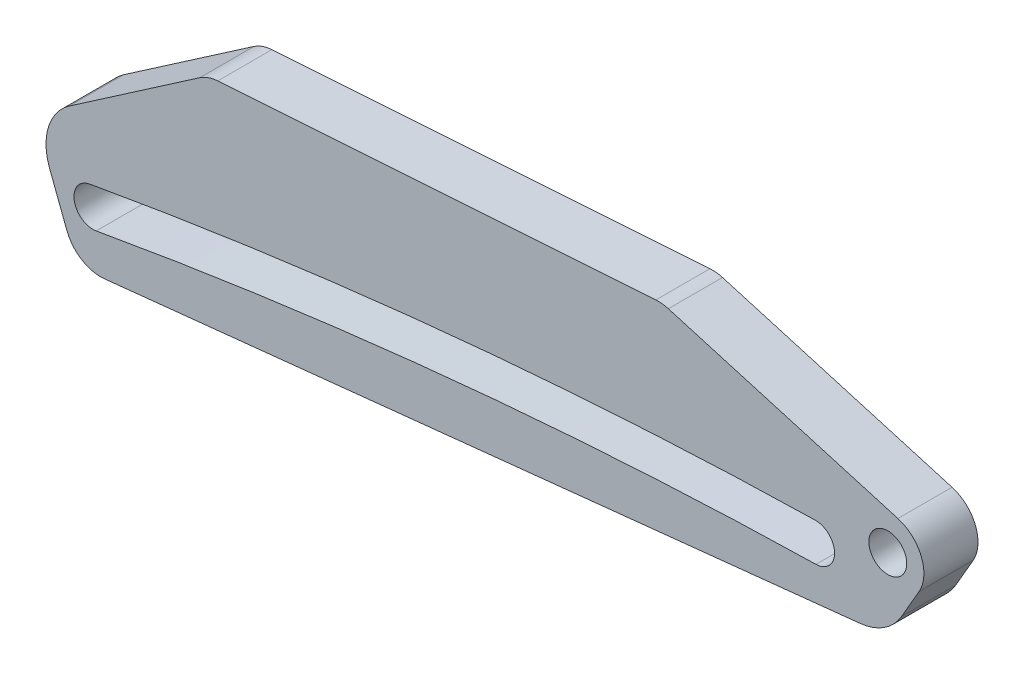
ISO-10303-21;
HEADER;
FILE_DESCRIPTION(('STEP AP214'),'2;1');
FILE_NAME('part.step','',(''),(''),'','','');
FILE_SCHEMA(('AUTOMOTIVE_DESIGN { 1 0 10303 214 1 1 1 1 }'));
ENDSEC;
DATA;
#1=APPLICATION_CONTEXT('core data for automotive mechanical design processes');
#2=APPLICATION_PROTOCOL_DEFINITION('international standard','automotive_design',2000,#1);
#3=PRODUCT_CONTEXT('',#1,'mechanical');
#4=PRODUCT('Part','Part','',(#3));
#5=PRODUCT_RELATED_PRODUCT_CATEGORY('part','',(#4));
#6=PRODUCT_DEFINITION_FORMATION('','',#4);
#7=PRODUCT_DEFINITION_CONTEXT('part definition',#1,'design');
#8=PRODUCT_DEFINITION('design','',#6,#7);
#9=PRODUCT_DEFINITION_SHAPE('','',#8);
#10=(LENGTH_UNIT() NAMED_UNIT(*) SI_UNIT(.MILLI.,.METRE.));
#11=(NAMED_UNIT(*) PLANE_ANGLE_UNIT() SI_UNIT($,.RADIAN.));
#12=(NAMED_UNIT(*) SI_UNIT($,.STERADIAN.) SOLID_ANGLE_UNIT());
#13=UNCERTAINTY_MEASURE_WITH_UNIT(LENGTH_MEASURE(1.E-05),#10,'distance_accuracy_value','');
#14=(GEOMETRIC_REPRESENTATION_CONTEXT(3) GLOBAL_UNCERTAINTY_ASSIGNED_CONTEXT((#13)) GLOBAL_UNIT_ASSIGNED_CONTEXT((#10,
#11,#12)) REPRESENTATION_CONTEXT('',''));
#15=CARTESIAN_POINT('',(0.,0.,0.));
#16=DIRECTION('',(0.,0.,1.));
#17=DIRECTION('',(1.,0.,0.));
#18=AXIS2_PLACEMENT_3D('',#15,#16,#17);
#19=CARTESIAN_POINT('',(1.46781969528307,-261.442499310482,0.));
#20=DIRECTION('',(0.,0.,1.));
#21=DIRECTION('',(1.,0.,0.));
#22=AXIS2_PLACEMENT_3D('',#19,#20,#21);
#23=CYLINDRICAL_SURFACE('',#22,261.05);
#24=DIRECTION('',(0.,0.,1.));
#25=VECTOR('',#24,1.);
#26=CARTESIAN_POINT('',(-44.2332287677884,-4.42398505639943,-4.94016647332351));
#27=LINE('',#26,#25);
#28=CARTESIAN_POINT('',(-44.2332287677884,-4.42398505639943,0.));
#29=VERTEX_POINT('',#28);
#30=CARTESIAN_POINT('',(-44.2332287677884,-4.42398505639943,3.));
#31=VERTEX_POINT('',#30);
#32=EDGE_CURVE('E162',#29,#31,#27,.T.);
#33=ORIENTED_EDGE('',*,*,#32,.F.);
#34=CARTESIAN_POINT('',(1.46781969528307,-261.442499310482,0.));
#35=DIRECTION('',(0.,0.,1.));
#36=DIRECTION('',(1.,0.,0.));
#37=AXIS2_PLACEMENT_3D('',#34,#35,#36);
#38=CIRCLE('',#37,261.05);
#39=CARTESIAN_POINT('',(-4.02208157953863,-0.450232214323054,0.));
#40=VERTEX_POINT('',#39);
#41=EDGE_CURVE('E189',#40,#29,#38,.T.);
#42=ORIENTED_EDGE('',*,*,#41,.F.);
#43=DIRECTION('',(0.,0.,1.));
#44=VECTOR('',#43,1.);
#45=CARTESIAN_POINT('',(-4.02208157953863,-0.450232214323054,0.));
#46=LINE('',#45,#44);
#47=CARTESIAN_POINT('',(-4.02208157953863,-0.450232214323054,3.));
#48=VERTEX_POINT('',#47);
#49=EDGE_CURVE('E198',#40,#48,#46,.T.);
#50=ORIENTED_EDGE('',*,*,#49,.T.);
#51=CARTESIAN_POINT('',(1.46781969528307,-261.442499310482,3.));
#52=DIRECTION('',(0.,0.,1.));
#53=DIRECTION('',(1.,0.,0.));
#54=AXIS2_PLACEMENT_3D('',#51,#52,#53);
#55=CIRCLE('',#54,261.05);
#56=EDGE_CURVE('E184',#48,#31,#55,.T.);
#57=ORIENTED_EDGE('',*,*,#56,.T.);
#58=EDGE_LOOP('',(#33,#42,#50,#57));
#59=FACE_BOUND('',#58,.T.);
#60=ADVANCED_FACE('F39',(#59),#23,.F.);
#61=CARTESIAN_POINT('',(0.,0.,3.));
#62=DIRECTION('',(0.,0.,1.));
#63=DIRECTION('',(1.,0.,0.));
#64=AXIS2_PLACEMENT_3D('',#61,#62,#63);
#65=PLANE('',#64);
#66=DIRECTION('',(-0.96007184811554,0.279753545922139,0.));
#67=VECTOR('',#66,1.);
#68=CARTESIAN_POINT('',(-12.5,5.72552912036351,3.));
#69=LINE('',#68,#67);
#70=CARTESIAN_POINT('',(0.559507091844279,1.92014369623108,3.));
#71=VERTEX_POINT('',#70);
#72=CARTESIAN_POINT('',(-12.1601101311318,5.62648924514425,3.));
#73=VERTEX_POINT('',#72);
#74=EDGE_CURVE('E227',#71,#73,#69,.T.);
#75=ORIENTED_EDGE('',*,*,#74,.T.);
#76=CARTESIAN_POINT('',(-12.7196172229761,3.70634554891317,3.));
#77=DIRECTION('',(0.,0.,1.));
#78=DIRECTION('',(1.,0.,0.));
#79=AXIS2_PLACEMENT_3D('',#76,#77,#78);
#80=CIRCLE('',#79,2.);
#81=CARTESIAN_POINT('',(-12.8532344898128,5.70187716379756,3.));
#82=VERTEX_POINT('',#81);
#83=EDGE_CURVE('E48',#73,#82,#80,.T.);
#84=ORIENTED_EDGE('',*,*,#83,.T.);
#85=DIRECTION('',(-0.997765807442194,-0.0668086334183352,0.));
#86=VECTOR('',#85,1.);
#87=CARTESIAN_POINT('',(-37.6791048015793,4.03958080469325,3.));
#88=LINE('',#87,#86);
#89=CARTESIAN_POINT('',(-37.131316921323,4.0762597121183,3.));
#90=VERTEX_POINT('',#89);
#91=EDGE_CURVE('E210',#82,#90,#88,.T.);
#92=ORIENTED_EDGE('',*,*,#91,.T.);
#93=CARTESIAN_POINT('',(-36.9976996544863,2.08072809723391,3.));
#94=DIRECTION('',(0.,0.,1.));
#95=DIRECTION('',(1.,0.,0.));
#96=AXIS2_PLACEMENT_3D('',#93,#94,#95);
#97=CIRCLE('',#96,2.);
#98=CARTESIAN_POINT('',(-38.1313952983483,3.72837314004146,3.));
#99=VERTEX_POINT('',#98);
#100=EDGE_CURVE('E55',#90,#99,#97,.T.);
#101=ORIENTED_EDGE('',*,*,#100,.T.);
#102=DIRECTION('',(-0.823822521403776,-0.566847821931006,0.));
#103=VECTOR('',#102,1.);
#104=CARTESIAN_POINT('',(-51.6017054133031,-5.54014738594075,3.));
#105=LINE('',#104,#103);
#106=CARTESIAN_POINT('',(-45.3497727668886,-1.23837811961789,3.));
#107=VERTEX_POINT('',#106);
#108=EDGE_CURVE('E213',#99,#107,#105,.T.);
#109=ORIENTED_EDGE('',*,*,#108,.T.);
#110=CARTESIAN_POINT('',(-43.6492293010956,-3.70984568382921,3.));
#111=DIRECTION('',(0.,0.,1.));
#112=DIRECTION('',(1.,0.,0.));
#113=AXIS2_PLACEMENT_3D('',#110,#111,#112);
#114=CIRCLE('',#113,3.);
#115=CARTESIAN_POINT('',(-46.4499705805872,-4.78494953246508,3.));
#116=VERTEX_POINT('',#115);
#117=EDGE_CURVE('E295',#107,#116,#114,.T.);
#118=ORIENTED_EDGE('',*,*,#117,.T.);
#119=DIRECTION('',(-0.358367949545291,0.933580426497206,0.));
#120=VECTOR('',#119,1.);
#121=CARTESIAN_POINT('',(-42.0853910215916,-16.1550680135909,3.));
#122=LINE('',#121,#120);
#123=CARTESIAN_POINT('',(-45.4881897622409,-7.29047422497155,3.));
#124=VERTEX_POINT('',#123);
#125=EDGE_CURVE('E168',#124,#116,#122,.T.);
#126=ORIENTED_EDGE('',*,*,#125,.F.);
#127=CARTESIAN_POINT('',(-43.6210289092464,-6.57373832588098,3.));
#128=DIRECTION('',(0.,0.,1.));
#129=DIRECTION('',(1.,0.,0.));
#130=AXIS2_PLACEMENT_3D('',#127,#128,#129);
#131=CIRCLE('',#130,2.);
#132=CARTESIAN_POINT('',(-43.4119719827111,-8.56278211661753,3.));
#133=VERTEX_POINT('',#132);
#134=EDGE_CURVE('E267',#124,#133,#131,.T.);
#135=ORIENTED_EDGE('',*,*,#134,.T.);
#136=DIRECTION('',(0.994521895368274,0.104528463267647,0.));
#137=VECTOR('',#136,1.);
#138=CARTESIAN_POINT('',(0.,-4.,3.));
#139=LINE('',#138,#137);
#140=CARTESIAN_POINT('',(-1.52020264730873,-4.15977973669423,3.));
#141=VERTEX_POINT('',#140);
#142=EDGE_CURVE('E217',#133,#141,#139,.T.);
#143=ORIENTED_EDGE('',*,*,#142,.T.);
#144=CARTESIAN_POINT('',(-1.83378803711167,-1.17621405058941,3.));
#145=DIRECTION('',(0.,0.,1.));
#146=DIRECTION('',(1.,0.,0.));
#147=AXIS2_PLACEMENT_3D('',#144,#145,#146);
#148=CIRCLE('',#147,3.);
#149=CARTESIAN_POINT('',(0.76428817424165,-2.67621405058941,3.));
#150=VERTEX_POINT('',#149);
#151=EDGE_CURVE('E280',#141,#150,#148,.T.);
#152=ORIENTED_EDGE('',*,*,#151,.T.);
#153=DIRECTION('',(0.5,0.866025403784439,0.));
#154=VECTOR('',#153,1.);
#155=CARTESIAN_POINT('',(1.73205080756888,-0.999999999999999,3.));
#156=LINE('',#155,#154);
#157=CARTESIAN_POINT('',(1.73205080756888,-0.999999999999999,3.));
#158=VERTEX_POINT('',#157);
#159=EDGE_CURVE('E221',#150,#158,#156,.T.);
#160=ORIENTED_EDGE('',*,*,#159,.T.);
#161=CARTESIAN_POINT('',(0.,0.,3.));
#162=DIRECTION('',(0.,0.,1.));
#163=DIRECTION('',(1.,0.,0.));
#164=AXIS2_PLACEMENT_3D('',#161,#162,#163);
#165=CIRCLE('',#164,2.);
#166=EDGE_CURVE('E224',#158,#71,#165,.T.);
#167=ORIENTED_EDGE('',*,*,#166,.T.);
#168=EDGE_LOOP('',(#75,#84,#92,#101,#109,#118,#126,#135,#143,#152,#160,#167));
#169=FACE_BOUND('',#168,.T.);
#170=CARTESIAN_POINT('',(1.46781969528307,-261.442499310482,3.));
#171=DIRECTION('',(0.,0.,-1.));
#172=DIRECTION('',(1.,0.,0.));
#173=AXIS2_PLACEMENT_3D('',#170,#171,#172);
#174=CIRCLE('',#173,258.95);
#175=CARTESIAN_POINT('',(-43.8655896114105,-6.49155402760641,3.));
#176=VERTEX_POINT('',#175);
#177=CARTESIAN_POINT('',(-3.97791842046134,-2.54976778567706,3.));
#178=VERTEX_POINT('',#177);
#179=EDGE_CURVE('E173',#176,#178,#174,.T.);
#180=ORIENTED_EDGE('',*,*,#179,.F.);
#181=CARTESIAN_POINT('',(-44.0494091895994,-5.45776954200292,3.));
#182=DIRECTION('',(0.,0.,-1.));
#183=DIRECTION('',(1.,0.,0.));
#184=AXIS2_PLACEMENT_3D('',#181,#182,#183);
#185=CIRCLE('',#184,1.05000000000002);
#186=EDGE_CURVE('E156',#176,#31,#185,.T.);
#187=ORIENTED_EDGE('',*,*,#186,.T.);
#188=ORIENTED_EDGE('',*,*,#56,.F.);
#189=CARTESIAN_POINT('',(-4.,-1.5,3.));
#190=DIRECTION('',(0.,0.,1.));
#191=DIRECTION('',(1.,0.,0.));
#192=AXIS2_PLACEMENT_3D('',#189,#190,#191);
#193=CIRCLE('',#192,1.05000000000005);
#194=EDGE_CURVE('E181',#178,#48,#193,.T.);
#195=ORIENTED_EDGE('',*,*,#194,.F.);
#196=EDGE_LOOP('',(#180,#187,#188,#195));
#197=FACE_BOUND('',#196,.T.);
#198=CARTESIAN_POINT('',(0.,0.,3.));
#199=DIRECTION('',(0.,0.,1.));
#200=DIRECTION('',(1.,0.,0.));
#201=AXIS2_PLACEMENT_3D('',#198,#199,#200);
#202=CIRCLE('',#201,1.05);
#203=CARTESIAN_POINT('',(1.05,0.,3.));
#204=VERTEX_POINT('',#203);
#205=EDGE_CURVE('E202',#204,#204,#202,.T.);
#206=ORIENTED_EDGE('',*,*,#205,.F.);
#207=EDGE_LOOP('',(#206));
#208=FACE_BOUND('',#207,.T.);
#209=ADVANCED_FACE('F179',(#169,#197,#208),#65,.T.);
#210=CARTESIAN_POINT('',(0.,0.,0.));
#211=DIRECTION('',(0.,0.,1.));
#212=DIRECTION('',(1.,0.,0.));
#213=AXIS2_PLACEMENT_3D('',#210,#211,#212);
#214=PLANE('',#213);
#215=CARTESIAN_POINT('',(-44.0494091895994,-5.45776954200292,0.));
#216=DIRECTION('',(0.,0.,1.));
#217=DIRECTION('',(1.,0.,0.));
#218=AXIS2_PLACEMENT_3D('',#215,#216,#217);
#219=CIRCLE('',#218,1.05000000000002);
#220=CARTESIAN_POINT('',(-43.8655896114105,-6.49155402760641,0.));
#221=VERTEX_POINT('',#220);
#222=EDGE_CURVE('E366',#29,#221,#219,.T.);
#223=ORIENTED_EDGE('',*,*,#222,.T.);
#224=CARTESIAN_POINT('',(1.46781969528307,-261.442499310482,0.));
#225=DIRECTION('',(0.,0.,-1.));
#226=DIRECTION('',(1.,0.,0.));
#227=AXIS2_PLACEMENT_3D('',#224,#225,#226);
#228=CIRCLE('',#227,258.95);
#229=CARTESIAN_POINT('',(-3.97791842046134,-2.54976778567706,0.));
#230=VERTEX_POINT('',#229);
#231=EDGE_CURVE('E175',#221,#230,#228,.T.);
#232=ORIENTED_EDGE('',*,*,#231,.T.);
#233=CARTESIAN_POINT('',(-4.,-1.5,0.));
#234=DIRECTION('',(0.,0.,1.));
#235=DIRECTION('',(1.,0.,0.));
#236=AXIS2_PLACEMENT_3D('',#233,#234,#235);
#237=CIRCLE('',#236,1.05000000000005);
#238=EDGE_CURVE('E183',#230,#40,#237,.T.);
#239=ORIENTED_EDGE('',*,*,#238,.T.);
#240=ORIENTED_EDGE('',*,*,#41,.T.);
#241=EDGE_LOOP('',(#223,#232,#239,#240));
#242=FACE_BOUND('',#241,.T.);
#243=DIRECTION('',(-0.997765807442194,-0.0668086334183352,0.));
#244=VECTOR('',#243,1.);
#245=CARTESIAN_POINT('',(-37.6791048015793,4.03958080469325,0.));
#246=LINE('',#245,#244);
#247=CARTESIAN_POINT('',(-12.8532344898128,5.70187716379756,0.));
#248=VERTEX_POINT('',#247);
#249=CARTESIAN_POINT('',(-37.131316921323,4.0762597121183,0.));
#250=VERTEX_POINT('',#249);
#251=EDGE_CURVE('E206',#248,#250,#246,.T.);
#252=ORIENTED_EDGE('',*,*,#251,.F.);
#253=CARTESIAN_POINT('',(-12.7196172229761,3.70634554891317,0.));
#254=DIRECTION('',(0.,0.,1.));
#255=DIRECTION('',(1.,0.,0.));
#256=AXIS2_PLACEMENT_3D('',#253,#254,#255);
#257=CIRCLE('',#256,2.);
#258=CARTESIAN_POINT('',(-12.1601101311318,5.62648924514425,0.));
#259=VERTEX_POINT('',#258);
#260=EDGE_CURVE('E308',#248,#259,#257,.F.);
#261=ORIENTED_EDGE('',*,*,#260,.T.);
#262=DIRECTION('',(-0.96007184811554,0.279753545922139,0.));
#263=VECTOR('',#262,1.);
#264=CARTESIAN_POINT('',(-12.5,5.72552912036351,0.));
#265=LINE('',#264,#263);
#266=CARTESIAN_POINT('',(0.559507091844279,1.92014369623108,0.));
#267=VERTEX_POINT('',#266);
#268=EDGE_CURVE('E214',#267,#259,#265,.T.);
#269=ORIENTED_EDGE('',*,*,#268,.F.);
#270=CARTESIAN_POINT('',(0.,0.,0.));
#271=DIRECTION('',(0.,0.,1.));
#272=DIRECTION('',(1.,0.,0.));
#273=AXIS2_PLACEMENT_3D('',#270,#271,#272);
#274=CIRCLE('',#273,2.);
#275=CARTESIAN_POINT('',(1.73205080756888,-0.999999999999999,0.));
#276=VERTEX_POINT('',#275);
#277=EDGE_CURVE('E244',#276,#267,#274,.T.);
#278=ORIENTED_EDGE('',*,*,#277,.F.);
#279=DIRECTION('',(0.5,0.866025403784439,0.));
#280=VECTOR('',#279,1.);
#281=CARTESIAN_POINT('',(1.73205080756888,-0.999999999999999,0.));
#282=LINE('',#281,#280);
#283=CARTESIAN_POINT('',(0.76428817424165,-2.67621405058941,0.));
#284=VERTEX_POINT('',#283);
#285=EDGE_CURVE('E241',#284,#276,#282,.T.);
#286=ORIENTED_EDGE('',*,*,#285,.F.);
#287=CARTESIAN_POINT('',(-1.83378803711167,-1.17621405058941,0.));
#288=DIRECTION('',(0.,0.,1.));
#289=DIRECTION('',(1.,0.,0.));
#290=AXIS2_PLACEMENT_3D('',#287,#288,#289);
#291=CIRCLE('',#290,3.);
#292=CARTESIAN_POINT('',(-1.52020264730873,-4.15977973669423,0.));
#293=VERTEX_POINT('',#292);
#294=EDGE_CURVE('E274',#284,#293,#291,.F.);
#295=ORIENTED_EDGE('',*,*,#294,.T.);
#296=DIRECTION('',(0.994521895368274,0.104528463267647,0.));
#297=VECTOR('',#296,1.);
#298=CARTESIAN_POINT('',(0.,-4.,0.));
#299=LINE('',#298,#297);
#300=CARTESIAN_POINT('',(-43.4119719827111,-8.56278211661753,0.));
#301=VERTEX_POINT('',#300);
#302=EDGE_CURVE('E237',#301,#293,#299,.T.);
#303=ORIENTED_EDGE('',*,*,#302,.F.);
#304=CARTESIAN_POINT('',(-43.6210289092464,-6.57373832588098,0.));
#305=DIRECTION('',(0.,0.,1.));
#306=DIRECTION('',(1.,0.,0.));
#307=AXIS2_PLACEMENT_3D('',#304,#305,#306);
#308=CIRCLE('',#307,2.);
#309=CARTESIAN_POINT('',(-45.4881897622409,-7.29047422497156,0.));
#310=VERTEX_POINT('',#309);
#311=EDGE_CURVE('E260',#301,#310,#308,.F.);
#312=ORIENTED_EDGE('',*,*,#311,.T.);
#313=DIRECTION('',(0.358367949545291,-0.933580426497205,0.));
#314=VECTOR('',#313,1.);
#315=CARTESIAN_POINT('',(-47.2970470912231,-2.57823977764864,0.));
#316=LINE('',#315,#314);
#317=CARTESIAN_POINT('',(-46.4499705805872,-4.78494953246509,0.));
#318=VERTEX_POINT('',#317);
#319=EDGE_CURVE('E356',#318,#310,#316,.T.);
#320=ORIENTED_EDGE('',*,*,#319,.F.);
#321=CARTESIAN_POINT('',(-43.6492293010956,-3.70984568382921,0.));
#322=DIRECTION('',(0.,0.,1.));
#323=DIRECTION('',(1.,0.,0.));
#324=AXIS2_PLACEMENT_3D('',#321,#322,#323);
#325=CIRCLE('',#324,3.);
#326=CARTESIAN_POINT('',(-45.3497727668886,-1.23837811961789,0.));
#327=VERTEX_POINT('',#326);
#328=EDGE_CURVE('E287',#318,#327,#325,.F.);
#329=ORIENTED_EDGE('',*,*,#328,.T.);
#330=DIRECTION('',(-0.823822521403776,-0.566847821931006,0.));
#331=VECTOR('',#330,1.);
#332=CARTESIAN_POINT('',(-51.6017054133031,-5.54014738594075,0.));
#333=LINE('',#332,#331);
#334=CARTESIAN_POINT('',(-38.1313952983483,3.72837314004146,0.));
#335=VERTEX_POINT('',#334);
#336=EDGE_CURVE('E234',#335,#327,#333,.T.);
#337=ORIENTED_EDGE('',*,*,#336,.F.);
#338=CARTESIAN_POINT('',(-36.9976996544863,2.08072809723391,0.));
#339=DIRECTION('',(0.,0.,1.));
#340=DIRECTION('',(1.,0.,0.));
#341=AXIS2_PLACEMENT_3D('',#338,#339,#340);
#342=CIRCLE('',#341,2.);
#343=EDGE_CURVE('E305',#335,#250,#342,.F.);
#344=ORIENTED_EDGE('',*,*,#343,.T.);
#345=EDGE_LOOP('',(#252,#261,#269,#278,#286,#295,#303,#312,#320,#329,#337,#344));
#346=FACE_BOUND('',#345,.T.);
#347=CARTESIAN_POINT('',(0.,0.,0.));
#348=DIRECTION('',(0.,0.,1.));
#349=DIRECTION('',(1.,0.,0.));
#350=AXIS2_PLACEMENT_3D('',#347,#348,#349);
#351=CIRCLE('',#350,1.05);
#352=CARTESIAN_POINT('',(1.05,0.,0.));
#353=VERTEX_POINT('',#352);
#354=EDGE_CURVE('E197',#353,#353,#351,.T.);
#355=ORIENTED_EDGE('',*,*,#354,.T.);
#356=EDGE_LOOP('',(#355));
#357=FACE_BOUND('',#356,.T.);
#358=ADVANCED_FACE('F326',(#242,#346,#357),#214,.F.);
#359=CARTESIAN_POINT('',(-37.6791048015793,4.03958080469325,3.));
#360=DIRECTION('',(0.0668086334183352,-0.997765807442195,0.));
#361=DIRECTION('',(0.997765807442195,0.0668086334183352,0.));
#362=AXIS2_PLACEMENT_3D('',#359,#360,#361);
#363=PLANE('',#362);
#364=ORIENTED_EDGE('',*,*,#91,.F.);
#365=DIRECTION('',(0.,0.,-1.));
#366=VECTOR('',#365,1.);
#367=CARTESIAN_POINT('',(-12.8532344898128,5.70187716379756,3.));
#368=LINE('',#367,#366);
#369=EDGE_CURVE('E301',#82,#248,#368,.T.);
#370=ORIENTED_EDGE('',*,*,#369,.T.);
#371=ORIENTED_EDGE('',*,*,#251,.T.);
#372=DIRECTION('',(0.,0.,-1.));
#373=VECTOR('',#372,1.);
#374=CARTESIAN_POINT('',(-37.131316921323,4.0762597121183,3.));
#375=LINE('',#374,#373);
#376=EDGE_CURVE('E298',#250,#90,#375,.F.);
#377=ORIENTED_EDGE('',*,*,#376,.T.);
#378=EDGE_LOOP('',(#364,#370,#371,#377));
#379=FACE_BOUND('',#378,.T.);
#380=ADVANCED_FACE('F320',(#379),#363,.F.);
#381=CARTESIAN_POINT('',(-51.6017054133031,-5.54014738594075,3.));
#382=DIRECTION('',(0.566847821931006,-0.823822521403776,0.));
#383=DIRECTION('',(0.823822521403776,0.566847821931006,0.));
#384=AXIS2_PLACEMENT_3D('',#381,#382,#383);
#385=PLANE('',#384);
#386=ORIENTED_EDGE('',*,*,#108,.F.);
#387=DIRECTION('',(0.,0.,-1.));
#388=VECTOR('',#387,1.);
#389=CARTESIAN_POINT('',(-38.1313952983483,3.72837314004146,3.));
#390=LINE('',#389,#388);
#391=EDGE_CURVE('E11',#99,#335,#390,.T.);
#392=ORIENTED_EDGE('',*,*,#391,.T.);
#393=ORIENTED_EDGE('',*,*,#336,.T.);
#394=DIRECTION('',(0.,0.,-1.));
#395=VECTOR('',#394,1.);
#396=CARTESIAN_POINT('',(-45.3497727668886,-1.23837811961789,3.));
#397=LINE('',#396,#395);
#398=EDGE_CURVE('E291',#327,#107,#397,.F.);
#399=ORIENTED_EDGE('',*,*,#398,.T.);
#400=EDGE_LOOP('',(#386,#392,#393,#399));
#401=FACE_BOUND('',#400,.T.);
#402=ADVANCED_FACE('F387',(#401),#385,.F.);
#403=CARTESIAN_POINT('',(0.,-4.,3.));
#404=DIRECTION('',(-0.104528463267647,0.994521895368274,0.));
#405=DIRECTION('',(-0.994521895368274,-0.104528463267647,0.));
#406=AXIS2_PLACEMENT_3D('',#403,#404,#405);
#407=PLANE('',#406);
#408=ORIENTED_EDGE('',*,*,#302,.T.);
#409=DIRECTION('',(0.,0.,-1.));
#410=VECTOR('',#409,1.);
#411=CARTESIAN_POINT('',(-1.52020264730873,-4.15977973669423,3.));
#412=LINE('',#411,#410);
#413=EDGE_CURVE('E277',#293,#141,#412,.F.);
#414=ORIENTED_EDGE('',*,*,#413,.T.);
#415=ORIENTED_EDGE('',*,*,#142,.F.);
#416=DIRECTION('',(0.,0.,-1.));
#417=VECTOR('',#416,1.);
#418=CARTESIAN_POINT('',(-43.4119719827111,-8.56278211661753,3.));
#419=LINE('',#418,#417);
#420=EDGE_CURVE('E256',#133,#301,#419,.T.);
#421=ORIENTED_EDGE('',*,*,#420,.T.);
#422=EDGE_LOOP('',(#408,#414,#415,#421));
#423=FACE_BOUND('',#422,.T.);
#424=ADVANCED_FACE('F347',(#423),#407,.F.);
#425=CARTESIAN_POINT('',(1.73205080756888,-0.999999999999999,3.));
#426=DIRECTION('',(-0.866025403784439,0.5,0.));
#427=DIRECTION('',(-0.5,-0.866025403784439,0.));
#428=AXIS2_PLACEMENT_3D('',#425,#426,#427);
#429=PLANE('',#428);
#430=ORIENTED_EDGE('',*,*,#159,.F.);
#431=DIRECTION('',(0.,0.,-1.));
#432=VECTOR('',#431,1.);
#433=CARTESIAN_POINT('',(0.76428817424165,-2.67621405058941,3.));
#434=LINE('',#433,#432);
#435=EDGE_CURVE('E270',#150,#284,#434,.T.);
#436=ORIENTED_EDGE('',*,*,#435,.T.);
#437=ORIENTED_EDGE('',*,*,#285,.T.);
#438=DIRECTION('',(0.,0.,-1.));
#439=VECTOR('',#438,1.);
#440=CARTESIAN_POINT('',(1.73205080756888,-0.999999999999999,3.));
#441=LINE('',#440,#439);
#442=EDGE_CURVE('E252',#158,#276,#441,.T.);
#443=ORIENTED_EDGE('',*,*,#442,.F.);
#444=EDGE_LOOP('',(#430,#436,#437,#443));
#445=FACE_BOUND('',#444,.T.);
#446=ADVANCED_FACE('F339',(#445),#429,.F.);
#447=CARTESIAN_POINT('',(0.,0.,3.));
#448=DIRECTION('',(0.,0.,-1.));
#449=DIRECTION('',(-1.,0.,0.));
#450=AXIS2_PLACEMENT_3D('',#447,#448,#449);
#451=CYLINDRICAL_SURFACE('',#450,2.);
#452=ORIENTED_EDGE('',*,*,#277,.T.);
#453=DIRECTION('',(0.,0.,-1.));
#454=VECTOR('',#453,1.);
#455=CARTESIAN_POINT('',(0.559507091844279,1.92014369623108,3.));
#456=LINE('',#455,#454);
#457=EDGE_CURVE('E230',#71,#267,#456,.T.);
#458=ORIENTED_EDGE('',*,*,#457,.F.);
#459=ORIENTED_EDGE('',*,*,#166,.F.);
#460=ORIENTED_EDGE('',*,*,#442,.T.);
#461=EDGE_LOOP('',(#452,#458,#459,#460));
#462=FACE_BOUND('',#461,.T.);
#463=ADVANCED_FACE('F333',(#462),#451,.T.);
#464=CARTESIAN_POINT('',(-12.5,5.72552912036351,3.));
#465=DIRECTION('',(-0.279753545922139,-0.96007184811554,0.));
#466=DIRECTION('',(0.960071848115541,-0.279753545922139,0.));
#467=AXIS2_PLACEMENT_3D('',#464,#465,#466);
#468=PLANE('',#467);
#469=ORIENTED_EDGE('',*,*,#268,.T.);
#470=DIRECTION('',(0.,0.,-1.));
#471=VECTOR('',#470,1.);
#472=CARTESIAN_POINT('',(-12.1601101311318,5.62648924514425,3.));
#473=LINE('',#472,#471);
#474=EDGE_CURVE('E63',#259,#73,#473,.F.);
#475=ORIENTED_EDGE('',*,*,#474,.T.);
#476=ORIENTED_EDGE('',*,*,#74,.F.);
#477=ORIENTED_EDGE('',*,*,#457,.T.);
#478=EDGE_LOOP('',(#469,#475,#476,#477));
#479=FACE_BOUND('',#478,.T.);
#480=ADVANCED_FACE('F329',(#479),#468,.F.);
#481=CARTESIAN_POINT('',(0.,0.,3.));
#482=DIRECTION('',(0.,0.,-1.));
#483=DIRECTION('',(-1.,0.,0.));
#484=AXIS2_PLACEMENT_3D('',#481,#482,#483);
#485=CYLINDRICAL_SURFACE('',#484,1.05);
#486=ORIENTED_EDGE('',*,*,#205,.T.);
#487=EDGE_LOOP('',(#486));
#488=FACE_BOUND('',#487,.T.);
#489=ORIENTED_EDGE('',*,*,#354,.F.);
#490=EDGE_LOOP('',(#489));
#491=FACE_BOUND('',#490,.T.);
#492=ADVANCED_FACE('F400',(#488,#491),#485,.F.);
#493=CARTESIAN_POINT('',(-4.,-1.5,0.));
#494=DIRECTION('',(0.,0.,1.));
#495=DIRECTION('',(1.,0.,0.));
#496=AXIS2_PLACEMENT_3D('',#493,#494,#495);
#497=CYLINDRICAL_SURFACE('',#496,1.05000000000005);
#498=ORIENTED_EDGE('',*,*,#194,.T.);
#499=ORIENTED_EDGE('',*,*,#49,.F.);
#500=ORIENTED_EDGE('',*,*,#238,.F.);
#501=DIRECTION('',(0.,0.,1.));
#502=VECTOR('',#501,1.);
#503=CARTESIAN_POINT('',(-3.97791842046134,-2.54976778567706,0.));
#504=LINE('',#503,#502);
#505=EDGE_CURVE('E194',#230,#178,#504,.T.);
#506=ORIENTED_EDGE('',*,*,#505,.T.);
#507=EDGE_LOOP('',(#498,#499,#500,#506));
#508=FACE_BOUND('',#507,.T.);
#509=ADVANCED_FACE('F376',(#508),#497,.F.);
#510=CARTESIAN_POINT('',(1.46781969528307,-261.442499310482,0.));
#511=DIRECTION('',(0.,0.,1.));
#512=DIRECTION('',(1.,0.,0.));
#513=AXIS2_PLACEMENT_3D('',#510,#511,#512);
#514=CYLINDRICAL_SURFACE('',#513,258.95);
#515=ORIENTED_EDGE('',*,*,#231,.F.);
#516=DIRECTION('',(0.,0.,1.));
#517=VECTOR('',#516,1.);
#518=CARTESIAN_POINT('',(-43.8655896114105,-6.49155402760641,-4.94016647332351));
#519=LINE('',#518,#517);
#520=EDGE_CURVE('E159',#221,#176,#519,.T.);
#521=ORIENTED_EDGE('',*,*,#520,.T.);
#522=ORIENTED_EDGE('',*,*,#179,.T.);
#523=ORIENTED_EDGE('',*,*,#505,.F.);
#524=EDGE_LOOP('',(#515,#521,#522,#523));
#525=FACE_BOUND('',#524,.T.);
#526=ADVANCED_FACE('F171',(#525),#514,.T.);
#527=CARTESIAN_POINT('',(-44.0494091895994,-5.45776954200292,-4.94016647332351));
#528=DIRECTION('',(0.,0.,1.));
#529=DIRECTION('',(1.,0.,0.));
#530=AXIS2_PLACEMENT_3D('',#527,#528,#529);
#531=CYLINDRICAL_SURFACE('',#530,1.05000000000002);
#532=ORIENTED_EDGE('',*,*,#222,.F.);
#533=ORIENTED_EDGE('',*,*,#32,.T.);
#534=ORIENTED_EDGE('',*,*,#186,.F.);
#535=ORIENTED_EDGE('',*,*,#520,.F.);
#536=EDGE_LOOP('',(#532,#533,#534,#535));
#537=FACE_BOUND('',#536,.T.);
#538=ADVANCED_FACE('F158',(#537),#531,.F.);
#539=CARTESIAN_POINT('',(-47.2970470912231,-2.57823977764864,3.000012));
#540=DIRECTION('',(0.933580426497205,0.358367949545291,0.));
#541=DIRECTION('',(-0.358367949545291,0.933580426497206,0.));
#542=AXIS2_PLACEMENT_3D('',#539,#540,#541);
#543=PLANE('',#542);
#544=ORIENTED_EDGE('',*,*,#125,.T.);
#545=DIRECTION('',(0.,0.,-1.));
#546=VECTOR('',#545,1.);
#547=CARTESIAN_POINT('',(-46.4499705805872,-4.78494953246508,3.000012));
#548=LINE('',#547,#546);
#549=EDGE_CURVE('E283',#116,#318,#548,.T.);
#550=ORIENTED_EDGE('',*,*,#549,.T.);
#551=ORIENTED_EDGE('',*,*,#319,.T.);
#552=DIRECTION('',(0.,0.,-1.));
#553=VECTOR('',#552,1.);
#554=CARTESIAN_POINT('',(-45.4881897622409,-7.29047422497156,3.000012));
#555=LINE('',#554,#553);
#556=EDGE_CURVE('E264',#310,#124,#555,.F.);
#557=ORIENTED_EDGE('',*,*,#556,.T.);
#558=EDGE_LOOP('',(#544,#550,#551,#557));
#559=FACE_BOUND('',#558,.T.);
#560=ADVANCED_FACE('F423',(#559),#543,.F.);
#561=CARTESIAN_POINT('',(-43.6210289092464,-6.57373832588098,3.));
#562=DIRECTION('',(0.,0.,-1.));
#563=DIRECTION('',(-1.,0.,0.));
#564=AXIS2_PLACEMENT_3D('',#561,#562,#563);
#565=CYLINDRICAL_SURFACE('',#564,2.);
#566=ORIENTED_EDGE('',*,*,#134,.F.);
#567=ORIENTED_EDGE('',*,*,#556,.F.);
#568=ORIENTED_EDGE('',*,*,#311,.F.);
#569=ORIENTED_EDGE('',*,*,#420,.F.);
#570=EDGE_LOOP('',(#566,#567,#568,#569));
#571=FACE_BOUND('',#570,.T.);
#572=ADVANCED_FACE('F354',(#571),#565,.T.);
#573=CARTESIAN_POINT('',(-1.83378803711167,-1.17621405058941,3.));
#574=DIRECTION('',(0.,0.,-1.));
#575=DIRECTION('',(-1.,0.,0.));
#576=AXIS2_PLACEMENT_3D('',#573,#574,#575);
#577=CYLINDRICAL_SURFACE('',#576,3.);
#578=ORIENTED_EDGE('',*,*,#151,.F.);
#579=ORIENTED_EDGE('',*,*,#413,.F.);
#580=ORIENTED_EDGE('',*,*,#294,.F.);
#581=ORIENTED_EDGE('',*,*,#435,.F.);
#582=EDGE_LOOP('',(#578,#579,#580,#581));
#583=FACE_BOUND('',#582,.T.);
#584=ADVANCED_FACE('F343',(#583),#577,.T.);
#585=CARTESIAN_POINT('',(-43.6492293010956,-3.70984568382921,3.000012));
#586=DIRECTION('',(0.,0.,-1.));
#587=DIRECTION('',(-1.,0.,0.));
#588=AXIS2_PLACEMENT_3D('',#585,#586,#587);
#589=CYLINDRICAL_SURFACE('',#588,3.);
#590=ORIENTED_EDGE('',*,*,#117,.F.);
#591=ORIENTED_EDGE('',*,*,#398,.F.);
#592=ORIENTED_EDGE('',*,*,#328,.F.);
#593=ORIENTED_EDGE('',*,*,#549,.F.);
#594=EDGE_LOOP('',(#590,#591,#592,#593));
#595=FACE_BOUND('',#594,.T.);
#596=ADVANCED_FACE('F426',(#595),#589,.T.);
#597=CARTESIAN_POINT('',(-12.7196172229761,3.70634554891317,3.));
#598=DIRECTION('',(0.,0.,-1.));
#599=DIRECTION('',(-1.,0.,0.));
#600=AXIS2_PLACEMENT_3D('',#597,#598,#599);
#601=CYLINDRICAL_SURFACE('',#600,2.);
#602=ORIENTED_EDGE('',*,*,#83,.F.);
#603=ORIENTED_EDGE('',*,*,#474,.F.);
#604=ORIENTED_EDGE('',*,*,#260,.F.);
#605=ORIENTED_EDGE('',*,*,#369,.F.);
#606=EDGE_LOOP('',(#602,#603,#604,#605));
#607=FACE_BOUND('',#606,.T.);
#608=ADVANCED_FACE('F323',(#607),#601,.T.);
#609=CARTESIAN_POINT('',(-36.9976996544863,2.08072809723391,3.));
#610=DIRECTION('',(0.,0.,-1.));
#611=DIRECTION('',(-1.,0.,0.));
#612=AXIS2_PLACEMENT_3D('',#609,#610,#611);
#613=CYLINDRICAL_SURFACE('',#612,2.);
#614=ORIENTED_EDGE('',*,*,#100,.F.);
#615=ORIENTED_EDGE('',*,*,#376,.F.);
#616=ORIENTED_EDGE('',*,*,#343,.F.);
#617=ORIENTED_EDGE('',*,*,#391,.F.);
#618=EDGE_LOOP('',(#614,#615,#616,#617));
#619=FACE_BOUND('',#618,.T.);
#620=ADVANCED_FACE('F41',(#619),#613,.T.);
#621=CLOSED_SHELL('',(#60,#209,#358,#380,#402,#424,#446,#463,#480,#492,#509,#526,#538,#560,#572,
#584,#596,#608,#620));
#622=MANIFOLD_SOLID_BREP('B2',#621);
#623=ADVANCED_BREP_SHAPE_REPRESENTATION('',(#18,#622),#14);
#624=SHAPE_DEFINITION_REPRESENTATION(#9,#623);
ENDSEC;
END-ISO-10303-21;
